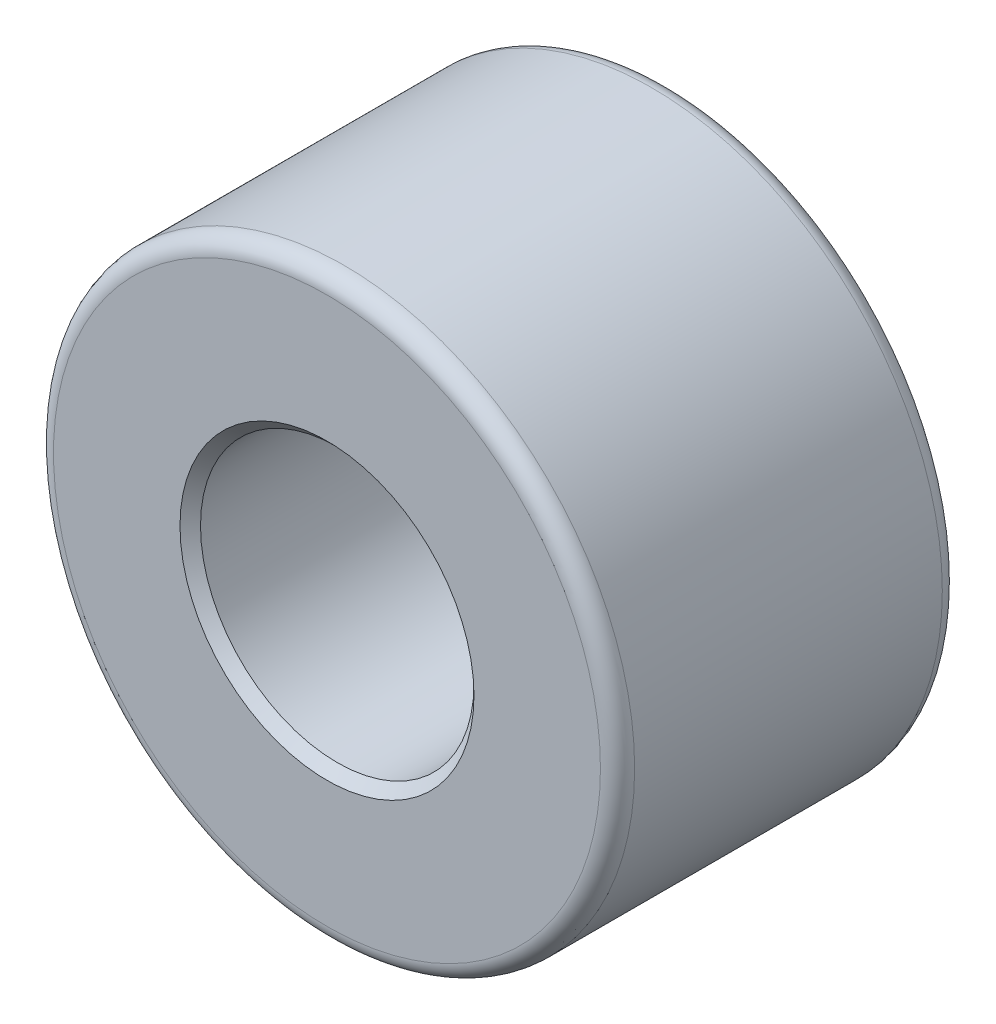
ISO-10303-21;
HEADER;
FILE_DESCRIPTION(('STEP AP214'),'2;1');
FILE_NAME('part.step','',(''),(''),'','','');
FILE_SCHEMA(('AUTOMOTIVE_DESIGN { 1 0 10303 214 1 1 1 1 }'));
ENDSEC;
DATA;
#1=APPLICATION_CONTEXT('core data for automotive mechanical design processes');
#2=APPLICATION_PROTOCOL_DEFINITION('international standard','automotive_design',2000,#1);
#3=PRODUCT_CONTEXT('',#1,'mechanical');
#4=PRODUCT('Part','Part','',(#3));
#5=PRODUCT_RELATED_PRODUCT_CATEGORY('part','',(#4));
#6=PRODUCT_DEFINITION_FORMATION('','',#4);
#7=PRODUCT_DEFINITION_CONTEXT('part definition',#1,'design');
#8=PRODUCT_DEFINITION('design','',#6,#7);
#9=PRODUCT_DEFINITION_SHAPE('','',#8);
#10=(LENGTH_UNIT() NAMED_UNIT(*) SI_UNIT(.MILLI.,.METRE.));
#11=(NAMED_UNIT(*) PLANE_ANGLE_UNIT() SI_UNIT($,.RADIAN.));
#12=(NAMED_UNIT(*) SI_UNIT($,.STERADIAN.) SOLID_ANGLE_UNIT());
#13=UNCERTAINTY_MEASURE_WITH_UNIT(LENGTH_MEASURE(1.E-05),#10,'distance_accuracy_value','');
#14=(GEOMETRIC_REPRESENTATION_CONTEXT(3) GLOBAL_UNCERTAINTY_ASSIGNED_CONTEXT((#13)) GLOBAL_UNIT_ASSIGNED_CONTEXT((#10,
#11,#12)) REPRESENTATION_CONTEXT('',''));
#15=CARTESIAN_POINT('',(0.,0.,0.));
#16=DIRECTION('',(0.,0.,1.));
#17=DIRECTION('',(1.,0.,0.));
#18=AXIS2_PLACEMENT_3D('',#15,#16,#17);
#19=CARTESIAN_POINT('',(0.,0.,10.));
#20=DIRECTION('',(0.,0.,1.));
#21=DIRECTION('',(1.,0.,0.));
#22=AXIS2_PLACEMENT_3D('',#19,#20,#21);
#23=PLANE('',#22);
#24=CARTESIAN_POINT('',(0.,0.,10.));
#25=DIRECTION('',(0.,0.,1.));
#26=DIRECTION('',(1.,0.,0.));
#27=AXIS2_PLACEMENT_3D('',#24,#25,#26);
#28=CIRCLE('',#27,4.3);
#29=CARTESIAN_POINT('',(4.3,0.,10.));
#30=VERTEX_POINT('',#29);
#31=EDGE_CURVE('E10',#30,#30,#28,.F.);
#32=ORIENTED_EDGE('',*,*,#31,.T.);
#33=EDGE_LOOP('',(#32));
#34=FACE_BOUND('',#33,.T.);
#35=CARTESIAN_POINT('',(0.,0.,10.));
#36=DIRECTION('',(0.,0.,1.));
#37=DIRECTION('',(1.,0.,0.));
#38=AXIS2_PLACEMENT_3D('',#35,#36,#37);
#39=CIRCLE('',#38,8.);
#40=CARTESIAN_POINT('',(8.,0.,10.));
#41=VERTEX_POINT('',#40);
#42=EDGE_CURVE('E66',#41,#41,#39,.T.);
#43=ORIENTED_EDGE('',*,*,#42,.T.);
#44=EDGE_LOOP('',(#43));
#45=FACE_BOUND('',#44,.T.);
#46=ADVANCED_FACE('F36',(#34,#45),#23,.T.);
#47=CARTESIAN_POINT('',(0.,0.,0.));
#48=DIRECTION('',(0.,0.,1.));
#49=DIRECTION('',(1.,0.,0.));
#50=AXIS2_PLACEMENT_3D('',#47,#48,#49);
#51=PLANE('',#50);
#52=CARTESIAN_POINT('',(0.,0.,0.));
#53=DIRECTION('',(0.,0.,1.));
#54=DIRECTION('',(1.,0.,0.));
#55=AXIS2_PLACEMENT_3D('',#52,#53,#54);
#56=CIRCLE('',#55,4.3);
#57=CARTESIAN_POINT('',(4.3,0.,0.));
#58=VERTEX_POINT('',#57);
#59=EDGE_CURVE('E52',#58,#58,#56,.T.);
#60=ORIENTED_EDGE('',*,*,#59,.T.);
#61=EDGE_LOOP('',(#60));
#62=FACE_BOUND('',#61,.T.);
#63=CARTESIAN_POINT('',(0.,0.,0.));
#64=DIRECTION('',(0.,0.,1.));
#65=DIRECTION('',(1.,0.,0.));
#66=AXIS2_PLACEMENT_3D('',#63,#64,#65);
#67=CIRCLE('',#66,8.);
#68=CARTESIAN_POINT('',(8.,0.,0.));
#69=VERTEX_POINT('',#68);
#70=EDGE_CURVE('E57',#69,#69,#67,.F.);
#71=ORIENTED_EDGE('',*,*,#70,.T.);
#72=EDGE_LOOP('',(#71));
#73=FACE_BOUND('',#72,.T.);
#74=ADVANCED_FACE('F89',(#62,#73),#51,.F.);
#75=CARTESIAN_POINT('',(0.,0.,10.));
#76=DIRECTION('',(0.,0.,-1.));
#77=DIRECTION('',(-1.,0.,0.));
#78=AXIS2_PLACEMENT_3D('',#75,#76,#77);
#79=CYLINDRICAL_SURFACE('',#78,8.5);
#80=CARTESIAN_POINT('',(0.,0.,9.5));
#81=DIRECTION('',(0.,0.,1.));
#82=DIRECTION('',(1.,0.,0.));
#83=AXIS2_PLACEMENT_3D('',#80,#81,#82);
#84=CIRCLE('',#83,8.5);
#85=CARTESIAN_POINT('',(8.5,0.,9.5));
#86=VERTEX_POINT('',#85);
#87=EDGE_CURVE('E60',#86,#86,#84,.F.);
#88=ORIENTED_EDGE('',*,*,#87,.T.);
#89=EDGE_LOOP('',(#88));
#90=FACE_BOUND('',#89,.T.);
#91=CARTESIAN_POINT('',(0.,0.,0.5));
#92=DIRECTION('',(0.,0.,1.));
#93=DIRECTION('',(1.,0.,0.));
#94=AXIS2_PLACEMENT_3D('',#91,#92,#93);
#95=CIRCLE('',#94,8.5);
#96=CARTESIAN_POINT('',(8.5,0.,0.5));
#97=VERTEX_POINT('',#96);
#98=EDGE_CURVE('E63',#97,#97,#95,.T.);
#99=ORIENTED_EDGE('',*,*,#98,.T.);
#100=EDGE_LOOP('',(#99));
#101=FACE_BOUND('',#100,.T.);
#102=ADVANCED_FACE('F84',(#90,#101),#79,.T.);
#103=CARTESIAN_POINT('',(0.,0.,10.));
#104=DIRECTION('',(0.,0.,-1.));
#105=DIRECTION('',(-1.,0.,0.));
#106=AXIS2_PLACEMENT_3D('',#103,#104,#105);
#107=CYLINDRICAL_SURFACE('',#106,4.);
#108=CARTESIAN_POINT('',(0.,0.,0.300000000000003));
#109=DIRECTION('',(0.,0.,1.));
#110=DIRECTION('',(1.,0.,0.));
#111=AXIS2_PLACEMENT_3D('',#108,#109,#110);
#112=CIRCLE('',#111,4.);
#113=CARTESIAN_POINT('',(4.,0.,0.300000000000003));
#114=VERTEX_POINT('',#113);
#115=EDGE_CURVE('E44',#114,#114,#112,.F.);
#116=ORIENTED_EDGE('',*,*,#115,.T.);
#117=EDGE_LOOP('',(#116));
#118=FACE_BOUND('',#117,.T.);
#119=CARTESIAN_POINT('',(0.,0.,9.7));
#120=DIRECTION('',(0.,0.,1.));
#121=DIRECTION('',(1.,0.,0.));
#122=AXIS2_PLACEMENT_3D('',#119,#120,#121);
#123=CIRCLE('',#122,4.);
#124=CARTESIAN_POINT('',(4.,0.,9.7));
#125=VERTEX_POINT('',#124);
#126=EDGE_CURVE('E48',#125,#125,#123,.T.);
#127=ORIENTED_EDGE('',*,*,#126,.T.);
#128=EDGE_LOOP('',(#127));
#129=FACE_BOUND('',#128,.T.);
#130=ADVANCED_FACE('F74',(#118,#129),#107,.F.);
#131=CARTESIAN_POINT('',(0.,0.,9.5));
#132=DIRECTION('',(0.,0.,1.));
#133=DIRECTION('',(1.,0.,0.));
#134=AXIS2_PLACEMENT_3D('',#131,#132,#133);
#135=TOROIDAL_SURFACE('',#134,8.,0.5);
#136=ORIENTED_EDGE('',*,*,#87,.F.);
#137=EDGE_LOOP('',(#136));
#138=FACE_BOUND('',#137,.T.);
#139=ORIENTED_EDGE('',*,*,#42,.F.);
#140=EDGE_LOOP('',(#139));
#141=FACE_BOUND('',#140,.T.);
#142=ADVANCED_FACE('F71',(#138,#141),#135,.T.);
#143=CARTESIAN_POINT('',(0.,0.,0.5));
#144=DIRECTION('',(0.,0.,1.));
#145=DIRECTION('',(1.,0.,0.));
#146=AXIS2_PLACEMENT_3D('',#143,#144,#145);
#147=TOROIDAL_SURFACE('',#146,8.,0.5);
#148=ORIENTED_EDGE('',*,*,#70,.F.);
#149=EDGE_LOOP('',(#148));
#150=FACE_BOUND('',#149,.T.);
#151=ORIENTED_EDGE('',*,*,#98,.F.);
#152=EDGE_LOOP('',(#151));
#153=FACE_BOUND('',#152,.T.);
#154=ADVANCED_FACE('F73',(#150,#153),#147,.T.);
#155=CARTESIAN_POINT('',(0.,0.,0.));
#156=DIRECTION('',(0.,0.,-1.));
#157=DIRECTION('',(-1.,0.,0.));
#158=AXIS2_PLACEMENT_3D('',#155,#156,#157);
#159=CONICAL_SURFACE('',#158,4.3,0.785398163397445);
#160=ORIENTED_EDGE('',*,*,#115,.F.);
#161=EDGE_LOOP('',(#160));
#162=FACE_BOUND('',#161,.T.);
#163=ORIENTED_EDGE('',*,*,#59,.F.);
#164=EDGE_LOOP('',(#163));
#165=FACE_BOUND('',#164,.T.);
#166=ADVANCED_FACE('F81',(#162,#165),#159,.F.);
#167=CARTESIAN_POINT('',(0.,0.,9.7));
#168=DIRECTION('',(0.,0.,1.));
#169=DIRECTION('',(1.,0.,0.));
#170=AXIS2_PLACEMENT_3D('',#167,#168,#169);
#171=CONICAL_SURFACE('',#170,4.,0.785398163397454);
#172=ORIENTED_EDGE('',*,*,#31,.F.);
#173=EDGE_LOOP('',(#172));
#174=FACE_BOUND('',#173,.T.);
#175=ORIENTED_EDGE('',*,*,#126,.F.);
#176=EDGE_LOOP('',(#175));
#177=FACE_BOUND('',#176,.T.);
#178=ADVANCED_FACE('F39',(#174,#177),#171,.F.);
#179=CLOSED_SHELL('',(#46,#74,#102,#130,#142,#154,#166,#178));
#180=MANIFOLD_SOLID_BREP('B2',#179);
#181=ADVANCED_BREP_SHAPE_REPRESENTATION('',(#18,#180),#14);
#182=SHAPE_DEFINITION_REPRESENTATION(#9,#181);
ENDSEC;
END-ISO-10303-21;
